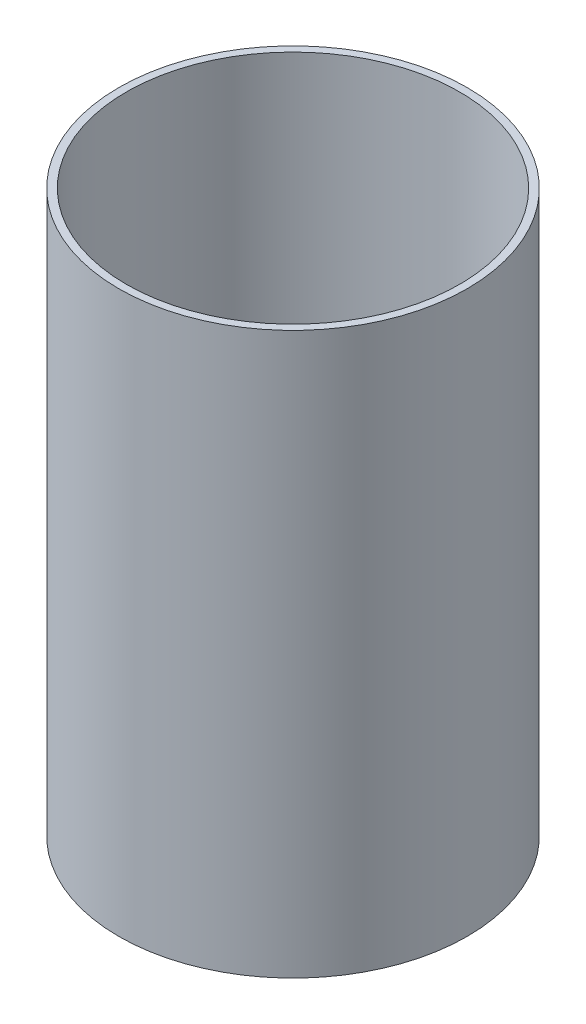
ISO-10303-21;
HEADER;
FILE_DESCRIPTION(('STEP AP214'),'2;1');
FILE_NAME('part.step','',(''),(''),'','','');
FILE_SCHEMA(('AUTOMOTIVE_DESIGN { 1 0 10303 214 1 1 1 1 }'));
ENDSEC;
DATA;
#1=APPLICATION_CONTEXT('core data for automotive mechanical design processes');
#2=APPLICATION_PROTOCOL_DEFINITION('international standard','automotive_design',2000,#1);
#3=PRODUCT_CONTEXT('',#1,'mechanical');
#4=PRODUCT('Part','Part','',(#3));
#5=PRODUCT_RELATED_PRODUCT_CATEGORY('part','',(#4));
#6=PRODUCT_DEFINITION_FORMATION('','',#4);
#7=PRODUCT_DEFINITION_CONTEXT('part definition',#1,'design');
#8=PRODUCT_DEFINITION('design','',#6,#7);
#9=PRODUCT_DEFINITION_SHAPE('','',#8);
#10=(LENGTH_UNIT() NAMED_UNIT(*) SI_UNIT(.MILLI.,.METRE.));
#11=(NAMED_UNIT(*) PLANE_ANGLE_UNIT() SI_UNIT($,.RADIAN.));
#12=(NAMED_UNIT(*) SI_UNIT($,.STERADIAN.) SOLID_ANGLE_UNIT());
#13=UNCERTAINTY_MEASURE_WITH_UNIT(LENGTH_MEASURE(1.E-05),#10,'distance_accuracy_value','');
#14=(GEOMETRIC_REPRESENTATION_CONTEXT(3) GLOBAL_UNCERTAINTY_ASSIGNED_CONTEXT((#13)) GLOBAL_UNIT_ASSIGNED_CONTEXT((#10,
#11,#12)) REPRESENTATION_CONTEXT('',''));
#15=CARTESIAN_POINT('',(0.,0.,0.));
#16=DIRECTION('',(0.,0.,1.));
#17=DIRECTION('',(1.,0.,0.));
#18=AXIS2_PLACEMENT_3D('',#15,#16,#17);
#19=CARTESIAN_POINT('',(77.25,-94.1238916256158,0.));
#20=DIRECTION('',(0.,1.,0.));
#21=DIRECTION('',(0.,0.,1.));
#22=AXIS2_PLACEMENT_3D('',#19,#20,#21);
#23=PLANE('',#22);
#24=CARTESIAN_POINT('',(0.,-94.1238916256158,0.));
#25=DIRECTION('',(0.,1.,0.));
#26=DIRECTION('',(0.,0.,1.));
#27=AXIS2_PLACEMENT_3D('',#24,#25,#26);
#28=CIRCLE('',#27,80.75);
#29=CARTESIAN_POINT('',(0.,-94.1238916256158,80.75));
#30=VERTEX_POINT('',#29);
#31=EDGE_CURVE('E47',#30,#30,#28,.T.);
#32=ORIENTED_EDGE('',*,*,#31,.F.);
#33=EDGE_LOOP('',(#32));
#34=FACE_BOUND('',#33,.T.);
#35=CARTESIAN_POINT('',(0.,-94.1238916256158,0.));
#36=DIRECTION('',(0.,1.,0.));
#37=DIRECTION('',(0.,0.,1.));
#38=AXIS2_PLACEMENT_3D('',#35,#36,#37);
#39=CIRCLE('',#38,77.25);
#40=CARTESIAN_POINT('',(0.,-94.1238916256158,77.25));
#41=VERTEX_POINT('',#40);
#42=EDGE_CURVE('E10',#41,#41,#39,.T.);
#43=ORIENTED_EDGE('',*,*,#42,.T.);
#44=EDGE_LOOP('',(#43));
#45=FACE_BOUND('',#44,.T.);
#46=ADVANCED_FACE('F33',(#34,#45),#23,.F.);
#47=CARTESIAN_POINT('',(0.,86.3245484400657,0.));
#48=DIRECTION('',(0.,1.,0.));
#49=DIRECTION('',(0.,0.,1.));
#50=AXIS2_PLACEMENT_3D('',#47,#48,#49);
#51=CYLINDRICAL_SURFACE('',#50,77.25);
#52=ORIENTED_EDGE('',*,*,#42,.F.);
#53=EDGE_LOOP('',(#52));
#54=FACE_BOUND('',#53,.T.);
#55=CARTESIAN_POINT('',(0.,165.876108374384,0.));
#56=DIRECTION('',(0.,1.,0.));
#57=DIRECTION('',(0.,0.,1.));
#58=AXIS2_PLACEMENT_3D('',#55,#56,#57);
#59=CIRCLE('',#58,77.25);
#60=CARTESIAN_POINT('',(0.,165.876108374384,77.25));
#61=VERTEX_POINT('',#60);
#62=EDGE_CURVE('E39',#61,#61,#59,.T.);
#63=ORIENTED_EDGE('',*,*,#62,.T.);
#64=EDGE_LOOP('',(#63));
#65=FACE_BOUND('',#64,.T.);
#66=ADVANCED_FACE('F56',(#54,#65),#51,.F.);
#67=CARTESIAN_POINT('',(80.75,165.876108374384,0.));
#68=DIRECTION('',(0.,-1.,0.));
#69=DIRECTION('',(0.,0.,-1.));
#70=AXIS2_PLACEMENT_3D('',#67,#68,#69);
#71=PLANE('',#70);
#72=ORIENTED_EDGE('',*,*,#62,.F.);
#73=EDGE_LOOP('',(#72));
#74=FACE_BOUND('',#73,.T.);
#75=CARTESIAN_POINT('',(0.,165.876108374384,0.));
#76=DIRECTION('',(0.,1.,0.));
#77=DIRECTION('',(0.,0.,1.));
#78=AXIS2_PLACEMENT_3D('',#75,#76,#77);
#79=CIRCLE('',#78,80.75);
#80=CARTESIAN_POINT('',(0.,165.876108374384,80.75));
#81=VERTEX_POINT('',#80);
#82=EDGE_CURVE('E43',#81,#81,#79,.T.);
#83=ORIENTED_EDGE('',*,*,#82,.T.);
#84=EDGE_LOOP('',(#83));
#85=FACE_BOUND('',#84,.T.);
#86=ADVANCED_FACE('F60',(#74,#85),#71,.F.);
#87=CARTESIAN_POINT('',(0.,86.3245484400657,0.));
#88=DIRECTION('',(0.,1.,0.));
#89=DIRECTION('',(0.,0.,1.));
#90=AXIS2_PLACEMENT_3D('',#87,#88,#89);
#91=CYLINDRICAL_SURFACE('',#90,80.75);
#92=ORIENTED_EDGE('',*,*,#82,.F.);
#93=EDGE_LOOP('',(#92));
#94=FACE_BOUND('',#93,.T.);
#95=ORIENTED_EDGE('',*,*,#31,.T.);
#96=EDGE_LOOP('',(#95));
#97=FACE_BOUND('',#96,.T.);
#98=ADVANCED_FACE('F53',(#94,#97),#91,.T.);
#99=CLOSED_SHELL('',(#46,#66,#86,#98));
#100=MANIFOLD_SOLID_BREP('B2',#99);
#101=ADVANCED_BREP_SHAPE_REPRESENTATION('',(#18,#100),#14);
#102=SHAPE_DEFINITION_REPRESENTATION(#9,#101);
ENDSEC;
END-ISO-10303-21;
